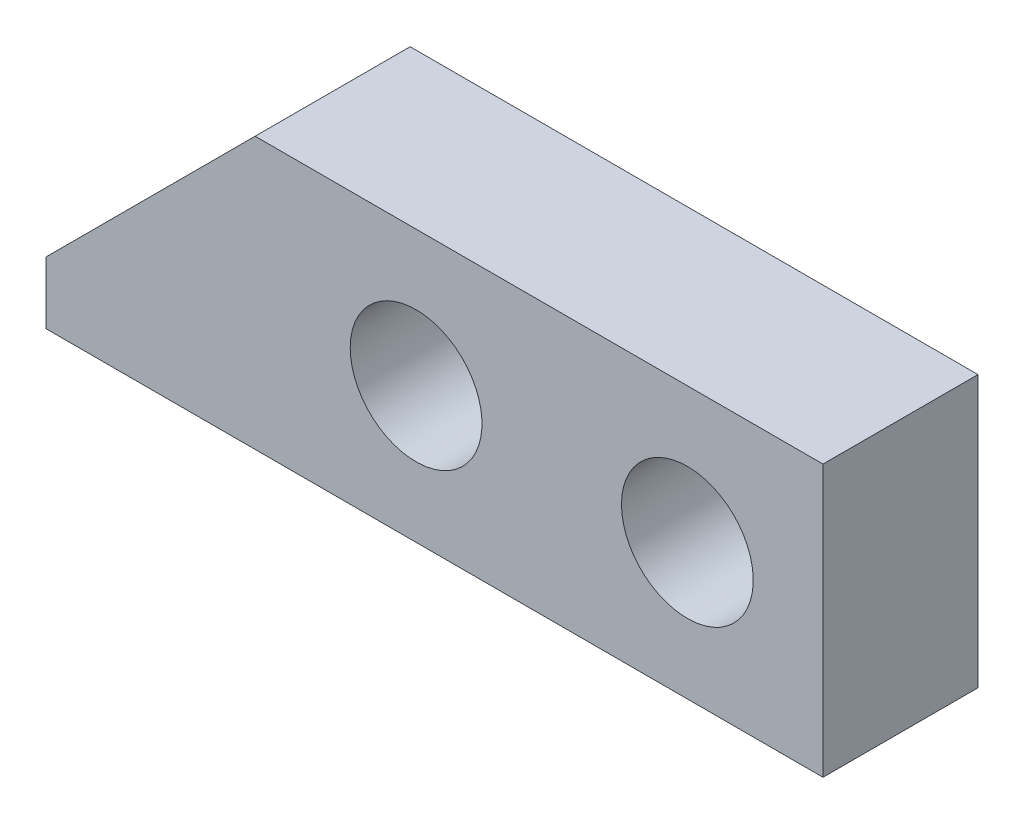
ISO-10303-21;
HEADER;
FILE_DESCRIPTION(('STEP AP214'),'2;1');
FILE_NAME('part.step','',(''),(''),'','','');
FILE_SCHEMA(('AUTOMOTIVE_DESIGN { 1 0 10303 214 1 1 1 1 }'));
ENDSEC;
DATA;
#1=APPLICATION_CONTEXT('core data for automotive mechanical design processes');
#2=APPLICATION_PROTOCOL_DEFINITION('international standard','automotive_design',2000,#1);
#3=PRODUCT_CONTEXT('',#1,'mechanical');
#4=PRODUCT('Part','Part','',(#3));
#5=PRODUCT_RELATED_PRODUCT_CATEGORY('part','',(#4));
#6=PRODUCT_DEFINITION_FORMATION('','',#4);
#7=PRODUCT_DEFINITION_CONTEXT('part definition',#1,'design');
#8=PRODUCT_DEFINITION('design','',#6,#7);
#9=PRODUCT_DEFINITION_SHAPE('','',#8);
#10=(LENGTH_UNIT() NAMED_UNIT(*) SI_UNIT(.MILLI.,.METRE.));
#11=(NAMED_UNIT(*) PLANE_ANGLE_UNIT() SI_UNIT($,.RADIAN.));
#12=(NAMED_UNIT(*) SI_UNIT($,.STERADIAN.) SOLID_ANGLE_UNIT());
#13=UNCERTAINTY_MEASURE_WITH_UNIT(LENGTH_MEASURE(1.E-05),#10,'distance_accuracy_value','');
#14=(GEOMETRIC_REPRESENTATION_CONTEXT(3) GLOBAL_UNCERTAINTY_ASSIGNED_CONTEXT((#13)) GLOBAL_UNIT_ASSIGNED_CONTEXT((#10,
#11,#12)) REPRESENTATION_CONTEXT('',''));
#15=CARTESIAN_POINT('',(0.,0.,0.));
#16=DIRECTION('',(0.,0.,1.));
#17=DIRECTION('',(1.,0.,0.));
#18=AXIS2_PLACEMENT_3D('',#15,#16,#17);
#19=CARTESIAN_POINT('',(0.,1.60364103295903,4.));
#20=DIRECTION('',(1.,0.,0.));
#21=DIRECTION('',(0.,1.,0.));
#22=AXIS2_PLACEMENT_3D('',#19,#20,#21);
#23=PLANE('',#22);
#24=DIRECTION('',(0.,-1.,0.));
#25=VECTOR('',#24,1.);
#26=CARTESIAN_POINT('',(0.,1.60364103295903,0.));
#27=LINE('',#26,#25);
#28=CARTESIAN_POINT('',(0.,1.60364103295903,0.));
#29=VERTEX_POINT('',#28);
#30=CARTESIAN_POINT('',(0.,0.,0.));
#31=VERTEX_POINT('',#30);
#32=EDGE_CURVE('E110',#29,#31,#27,.T.);
#33=ORIENTED_EDGE('',*,*,#32,.T.);
#34=DIRECTION('',(0.,0.,-1.));
#35=VECTOR('',#34,1.);
#36=CARTESIAN_POINT('',(0.,0.,4.));
#37=LINE('',#36,#35);
#38=CARTESIAN_POINT('',(0.,0.,4.));
#39=VERTEX_POINT('',#38);
#40=EDGE_CURVE('E11',#39,#31,#37,.T.);
#41=ORIENTED_EDGE('',*,*,#40,.F.);
#42=DIRECTION('',(0.,-1.,0.));
#43=VECTOR('',#42,1.);
#44=CARTESIAN_POINT('',(0.,1.60364103295903,4.));
#45=LINE('',#44,#43);
#46=CARTESIAN_POINT('',(0.,1.60364103295903,4.));
#47=VERTEX_POINT('',#46);
#48=EDGE_CURVE('E119',#47,#39,#45,.T.);
#49=ORIENTED_EDGE('',*,*,#48,.F.);
#50=DIRECTION('',(0.,0.,-1.));
#51=VECTOR('',#50,1.);
#52=CARTESIAN_POINT('',(0.,1.60364103295903,4.));
#53=LINE('',#52,#51);
#54=EDGE_CURVE('E106',#47,#29,#53,.T.);
#55=ORIENTED_EDGE('',*,*,#54,.T.);
#56=EDGE_LOOP('',(#33,#41,#49,#55));
#57=FACE_BOUND('',#56,.T.);
#58=ADVANCED_FACE('F36',(#57),#23,.F.);
#59=CARTESIAN_POINT('',(20.05,0.,4.));
#60=DIRECTION('',(0.,1.,0.));
#61=DIRECTION('',(0.,0.,1.));
#62=AXIS2_PLACEMENT_3D('',#59,#60,#61);
#63=PLANE('',#62);
#64=CARTESIAN_POINT('',(7.00000000000001,0.,2.));
#65=DIRECTION('',(0.,1.,0.));
#66=DIRECTION('',(-1.,0.,0.));
#67=AXIS2_PLACEMENT_3D('',#64,#65,#66);
#68=ELLIPSE('',#67,1.34350288425444,0.949999999999997);
#69=CARTESIAN_POINT('',(5.65649711574557,0.,2.));
#70=VERTEX_POINT('',#69);
#71=EDGE_CURVE('E152',#70,#70,#68,.T.);
#72=ORIENTED_EDGE('',*,*,#71,.T.);
#73=EDGE_LOOP('',(#72));
#74=FACE_BOUND('',#73,.T.);
#75=DIRECTION('',(1.,0.,0.));
#76=VECTOR('',#75,1.);
#77=CARTESIAN_POINT('',(20.05,0.,0.));
#78=LINE('',#77,#76);
#79=CARTESIAN_POINT('',(20.05,0.,0.));
#80=VERTEX_POINT('',#79);
#81=EDGE_CURVE('E113',#31,#80,#78,.T.);
#82=ORIENTED_EDGE('',*,*,#81,.T.);
#83=DIRECTION('',(0.,0.,-1.));
#84=VECTOR('',#83,1.);
#85=CARTESIAN_POINT('',(20.05,0.,4.));
#86=LINE('',#85,#84);
#87=CARTESIAN_POINT('',(20.05,0.,4.));
#88=VERTEX_POINT('',#87);
#89=EDGE_CURVE('E44',#88,#80,#86,.T.);
#90=ORIENTED_EDGE('',*,*,#89,.F.);
#91=DIRECTION('',(1.,0.,0.));
#92=VECTOR('',#91,1.);
#93=CARTESIAN_POINT('',(20.05,0.,4.));
#94=LINE('',#93,#92);
#95=EDGE_CURVE('E86',#39,#88,#94,.T.);
#96=ORIENTED_EDGE('',*,*,#95,.F.);
#97=ORIENTED_EDGE('',*,*,#40,.T.);
#98=EDGE_LOOP('',(#82,#90,#96,#97));
#99=FACE_BOUND('',#98,.T.);
#100=ADVANCED_FACE('F141',(#74,#99),#63,.F.);
#101=CARTESIAN_POINT('',(20.05,7.,4.));
#102=DIRECTION('',(-1.,0.,0.));
#103=DIRECTION('',(0.,0.,1.));
#104=AXIS2_PLACEMENT_3D('',#101,#102,#103);
#105=PLANE('',#104);
#106=DIRECTION('',(0.,1.,0.));
#107=VECTOR('',#106,1.);
#108=CARTESIAN_POINT('',(20.05,7.,0.));
#109=LINE('',#108,#107);
#110=CARTESIAN_POINT('',(20.05,7.,0.));
#111=VERTEX_POINT('',#110);
#112=EDGE_CURVE('E101',#80,#111,#109,.T.);
#113=ORIENTED_EDGE('',*,*,#112,.T.);
#114=DIRECTION('',(0.,0.,-1.));
#115=VECTOR('',#114,1.);
#116=CARTESIAN_POINT('',(20.05,7.,4.));
#117=LINE('',#116,#115);
#118=CARTESIAN_POINT('',(20.05,7.,4.));
#119=VERTEX_POINT('',#118);
#120=EDGE_CURVE('E98',#119,#111,#117,.T.);
#121=ORIENTED_EDGE('',*,*,#120,.F.);
#122=DIRECTION('',(0.,1.,0.));
#123=VECTOR('',#122,1.);
#124=CARTESIAN_POINT('',(20.05,7.,4.));
#125=LINE('',#124,#123);
#126=EDGE_CURVE('E90',#88,#119,#125,.T.);
#127=ORIENTED_EDGE('',*,*,#126,.F.);
#128=ORIENTED_EDGE('',*,*,#89,.T.);
#129=EDGE_LOOP('',(#113,#121,#127,#128));
#130=FACE_BOUND('',#129,.T.);
#131=ADVANCED_FACE('F99',(#130),#105,.F.);
#132=CARTESIAN_POINT('',(5.39635896704095,7.,4.));
#133=DIRECTION('',(0.,-1.,0.));
#134=DIRECTION('',(0.,0.,-1.));
#135=AXIS2_PLACEMENT_3D('',#132,#133,#134);
#136=PLANE('',#135);
#137=DIRECTION('',(-1.,0.,0.));
#138=VECTOR('',#137,1.);
#139=CARTESIAN_POINT('',(5.39635896704095,7.,0.));
#140=LINE('',#139,#138);
#141=CARTESIAN_POINT('',(5.39635896704095,7.,0.));
#142=VERTEX_POINT('',#141);
#143=EDGE_CURVE('E72',#111,#142,#140,.T.);
#144=ORIENTED_EDGE('',*,*,#143,.T.);
#145=DIRECTION('',(0.,0.,-1.));
#146=VECTOR('',#145,1.);
#147=CARTESIAN_POINT('',(5.39635896704095,7.,4.));
#148=LINE('',#147,#146);
#149=CARTESIAN_POINT('',(5.39635896704095,7.,4.));
#150=VERTEX_POINT('',#149);
#151=EDGE_CURVE('E102',#150,#142,#148,.T.);
#152=ORIENTED_EDGE('',*,*,#151,.F.);
#153=DIRECTION('',(-1.,0.,0.));
#154=VECTOR('',#153,1.);
#155=CARTESIAN_POINT('',(5.39635896704095,7.,4.));
#156=LINE('',#155,#154);
#157=EDGE_CURVE('E94',#119,#150,#156,.T.);
#158=ORIENTED_EDGE('',*,*,#157,.F.);
#159=ORIENTED_EDGE('',*,*,#120,.T.);
#160=EDGE_LOOP('',(#144,#152,#158,#159));
#161=FACE_BOUND('',#160,.T.);
#162=ADVANCED_FACE('F104',(#161),#136,.F.);
#163=CARTESIAN_POINT('',(5.39635896704095,7.,4.));
#164=DIRECTION('',(0.707106781186549,-0.707106781186546,0.));
#165=DIRECTION('',(0.707106781186546,0.707106781186549,0.));
#166=AXIS2_PLACEMENT_3D('',#163,#164,#165);
#167=PLANE('',#166);
#168=CARTESIAN_POINT('',(2.69817948352047,4.30182051647951,2.));
#169=DIRECTION('',(-0.707106781186549,0.707106781186546,0.));
#170=DIRECTION('',(-0.707106781186546,-0.707106781186549,0.));
#171=AXIS2_PLACEMENT_3D('',#168,#169,#170);
#172=CIRCLE('',#171,0.949999999999998);
#173=CARTESIAN_POINT('',(2.02642804139326,3.63006907435229,2.));
#174=VERTEX_POINT('',#173);
#175=EDGE_CURVE('E155',#174,#174,#172,.T.);
#176=ORIENTED_EDGE('',*,*,#175,.F.);
#177=EDGE_LOOP('',(#176));
#178=FACE_BOUND('',#177,.T.);
#179=DIRECTION('',(-0.707106781186546,-0.707106781186549,0.));
#180=VECTOR('',#179,1.);
#181=CARTESIAN_POINT('',(5.39635896704095,7.,0.));
#182=LINE('',#181,#180);
#183=EDGE_CURVE('E78',#142,#29,#182,.T.);
#184=ORIENTED_EDGE('',*,*,#183,.T.);
#185=ORIENTED_EDGE('',*,*,#54,.F.);
#186=DIRECTION('',(-0.707106781186546,-0.707106781186549,0.));
#187=VECTOR('',#186,1.);
#188=CARTESIAN_POINT('',(5.39635896704095,7.,4.));
#189=LINE('',#188,#187);
#190=EDGE_CURVE('E52',#150,#47,#189,.T.);
#191=ORIENTED_EDGE('',*,*,#190,.F.);
#192=ORIENTED_EDGE('',*,*,#151,.T.);
#193=EDGE_LOOP('',(#184,#185,#191,#192));
#194=FACE_BOUND('',#193,.T.);
#195=ADVANCED_FACE('F127',(#178,#194),#167,.F.);
#196=CARTESIAN_POINT('',(0.,0.,4.));
#197=DIRECTION('',(0.,0.,-1.));
#198=DIRECTION('',(-1.,0.,0.));
#199=AXIS2_PLACEMENT_3D('',#196,#197,#198);
#200=PLANE('',#199);
#201=CARTESIAN_POINT('',(16.55,3.5,4.));
#202=DIRECTION('',(0.,0.,-1.));
#203=DIRECTION('',(-1.,0.,0.));
#204=AXIS2_PLACEMENT_3D('',#201,#202,#203);
#205=CIRCLE('',#204,1.7);
#206=CARTESIAN_POINT('',(14.85,3.5,4.));
#207=VERTEX_POINT('',#206);
#208=EDGE_CURVE('E165',#207,#207,#205,.T.);
#209=ORIENTED_EDGE('',*,*,#208,.T.);
#210=EDGE_LOOP('',(#209));
#211=FACE_BOUND('',#210,.T.);
#212=CARTESIAN_POINT('',(9.55,3.5,4.));
#213=DIRECTION('',(0.,0.,-1.));
#214=DIRECTION('',(-1.,0.,0.));
#215=AXIS2_PLACEMENT_3D('',#212,#213,#214);
#216=CIRCLE('',#215,1.7);
#217=CARTESIAN_POINT('',(7.85,3.5,4.));
#218=VERTEX_POINT('',#217);
#219=EDGE_CURVE('E114',#218,#218,#216,.T.);
#220=ORIENTED_EDGE('',*,*,#219,.T.);
#221=EDGE_LOOP('',(#220));
#222=FACE_BOUND('',#221,.T.);
#223=ORIENTED_EDGE('',*,*,#48,.T.);
#224=ORIENTED_EDGE('',*,*,#95,.T.);
#225=ORIENTED_EDGE('',*,*,#126,.T.);
#226=ORIENTED_EDGE('',*,*,#157,.T.);
#227=ORIENTED_EDGE('',*,*,#190,.T.);
#228=EDGE_LOOP('',(#223,#224,#225,#226,#227));
#229=FACE_BOUND('',#228,.T.);
#230=ADVANCED_FACE('F92',(#211,#222,#229),#200,.F.);
#231=CARTESIAN_POINT('',(0.,0.,0.));
#232=DIRECTION('',(0.,0.,-1.));
#233=DIRECTION('',(-1.,0.,0.));
#234=AXIS2_PLACEMENT_3D('',#231,#232,#233);
#235=PLANE('',#234);
#236=CARTESIAN_POINT('',(16.55,3.5,0.));
#237=DIRECTION('',(0.,0.,-1.));
#238=DIRECTION('',(-1.,0.,0.));
#239=AXIS2_PLACEMENT_3D('',#236,#237,#238);
#240=CIRCLE('',#239,3.15);
#241=CARTESIAN_POINT('',(13.4,3.5,0.));
#242=VERTEX_POINT('',#241);
#243=EDGE_CURVE('E154',#242,#242,#240,.T.);
#244=ORIENTED_EDGE('',*,*,#243,.F.);
#245=EDGE_LOOP('',(#244));
#246=FACE_BOUND('',#245,.T.);
#247=CARTESIAN_POINT('',(9.55,3.5,0.));
#248=DIRECTION('',(0.,0.,-1.));
#249=DIRECTION('',(-1.,0.,0.));
#250=AXIS2_PLACEMENT_3D('',#247,#248,#249);
#251=CIRCLE('',#250,3.15);
#252=CARTESIAN_POINT('',(6.4,3.5,0.));
#253=VERTEX_POINT('',#252);
#254=EDGE_CURVE('E168',#253,#253,#251,.T.);
#255=ORIENTED_EDGE('',*,*,#254,.F.);
#256=EDGE_LOOP('',(#255));
#257=FACE_BOUND('',#256,.T.);
#258=ORIENTED_EDGE('',*,*,#32,.F.);
#259=ORIENTED_EDGE('',*,*,#183,.F.);
#260=ORIENTED_EDGE('',*,*,#143,.F.);
#261=ORIENTED_EDGE('',*,*,#112,.F.);
#262=ORIENTED_EDGE('',*,*,#81,.F.);
#263=EDGE_LOOP('',(#258,#259,#260,#261,#262));
#264=FACE_BOUND('',#263,.T.);
#265=ADVANCED_FACE('F123',(#246,#257,#264),#235,.T.);
#266=CARTESIAN_POINT('',(9.55,3.5,0.));
#267=DIRECTION('',(0.,0.,-1.));
#268=DIRECTION('',(-1.,0.,0.));
#269=AXIS2_PLACEMENT_3D('',#266,#267,#268);
#270=CYLINDRICAL_SURFACE('',#269,1.7);
#271=ORIENTED_EDGE('',*,*,#219,.F.);
#272=EDGE_LOOP('',(#271));
#273=FACE_BOUND('',#272,.T.);
#274=CARTESIAN_POINT('',(9.55,3.5,1.45));
#275=DIRECTION('',(0.,0.,-1.));
#276=DIRECTION('',(-1.,0.,0.));
#277=AXIS2_PLACEMENT_3D('',#274,#275,#276);
#278=CIRCLE('',#277,1.7);
#279=CARTESIAN_POINT('',(7.85,3.5,1.45));
#280=VERTEX_POINT('',#279);
#281=EDGE_CURVE('E171',#280,#280,#278,.T.);
#282=ORIENTED_EDGE('',*,*,#281,.T.);
#283=EDGE_LOOP('',(#282));
#284=FACE_BOUND('',#283,.T.);
#285=ADVANCED_FACE('F179',(#273,#284),#270,.F.);
#286=CARTESIAN_POINT('',(9.55,3.5,0.));
#287=DIRECTION('',(0.,0.,-1.));
#288=DIRECTION('',(-1.,0.,0.));
#289=AXIS2_PLACEMENT_3D('',#286,#287,#288);
#290=CONICAL_SURFACE('',#289,3.15,0.785398163397448);
#291=ORIENTED_EDGE('',*,*,#281,.F.);
#292=EDGE_LOOP('',(#291));
#293=FACE_BOUND('',#292,.T.);
#294=ORIENTED_EDGE('',*,*,#254,.T.);
#295=EDGE_LOOP('',(#294));
#296=FACE_BOUND('',#295,.T.);
#297=ADVANCED_FACE('F182',(#293,#296),#290,.F.);
#298=CARTESIAN_POINT('',(16.55,3.5,0.));
#299=DIRECTION('',(0.,0.,-1.));
#300=DIRECTION('',(-1.,0.,0.));
#301=AXIS2_PLACEMENT_3D('',#298,#299,#300);
#302=CYLINDRICAL_SURFACE('',#301,1.7);
#303=ORIENTED_EDGE('',*,*,#208,.F.);
#304=EDGE_LOOP('',(#303));
#305=FACE_BOUND('',#304,.T.);
#306=CARTESIAN_POINT('',(16.55,3.5,1.45));
#307=DIRECTION('',(0.,0.,-1.));
#308=DIRECTION('',(-1.,0.,0.));
#309=AXIS2_PLACEMENT_3D('',#306,#307,#308);
#310=CIRCLE('',#309,1.7);
#311=CARTESIAN_POINT('',(14.85,3.5,1.45));
#312=VERTEX_POINT('',#311);
#313=EDGE_CURVE('E158',#312,#312,#310,.T.);
#314=ORIENTED_EDGE('',*,*,#313,.T.);
#315=EDGE_LOOP('',(#314));
#316=FACE_BOUND('',#315,.T.);
#317=ADVANCED_FACE('F188',(#305,#316),#302,.F.);
#318=CARTESIAN_POINT('',(16.55,3.5,0.));
#319=DIRECTION('',(0.,0.,-1.));
#320=DIRECTION('',(-1.,0.,0.));
#321=AXIS2_PLACEMENT_3D('',#318,#319,#320);
#322=CONICAL_SURFACE('',#321,3.15,0.785398163397447);
#323=ORIENTED_EDGE('',*,*,#313,.F.);
#324=EDGE_LOOP('',(#323));
#325=FACE_BOUND('',#324,.T.);
#326=ORIENTED_EDGE('',*,*,#243,.T.);
#327=EDGE_LOOP('',(#326));
#328=FACE_BOUND('',#327,.T.);
#329=ADVANCED_FACE('F200',(#325,#328),#322,.F.);
#330=CARTESIAN_POINT('',(2.69817948352047,4.30182051647951,2.));
#331=DIRECTION('',(-0.707106781186549,0.707106781186546,0.));
#332=DIRECTION('',(-0.707106781186546,-0.707106781186549,0.));
#333=AXIS2_PLACEMENT_3D('',#330,#331,#332);
#334=CYLINDRICAL_SURFACE('',#333,0.949999999999997);
#335=ORIENTED_EDGE('',*,*,#175,.T.);
#336=EDGE_LOOP('',(#335));
#337=FACE_BOUND('',#336,.T.);
#338=ORIENTED_EDGE('',*,*,#71,.F.);
#339=EDGE_LOOP('',(#338));
#340=FACE_BOUND('',#339,.T.);
#341=ADVANCED_FACE('F204',(#337,#340),#334,.F.);
#342=CLOSED_SHELL('',(#58,#100,#131,#162,#195,#230,#265,#285,#297,#317,#329,#341));
#343=MANIFOLD_SOLID_BREP('B2',#342);
#344=ADVANCED_BREP_SHAPE_REPRESENTATION('',(#18,#343),#14);
#345=SHAPE_DEFINITION_REPRESENTATION(#9,#344);
ENDSEC;
END-ISO-10303-21;
